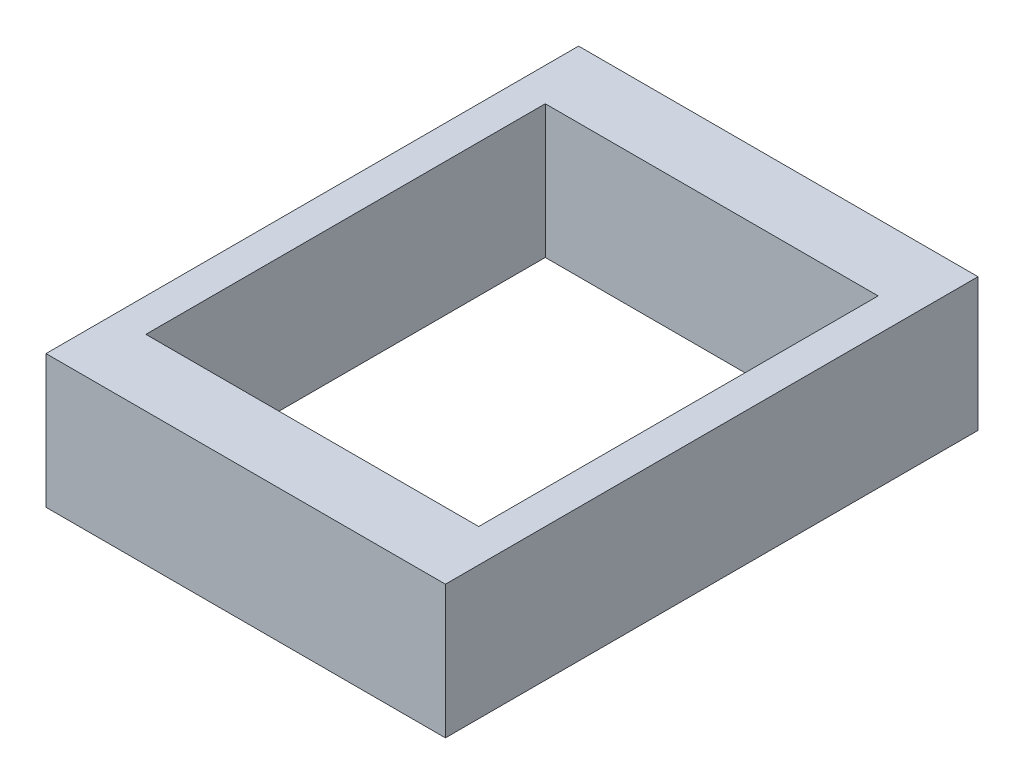
ISO-10303-21;
HEADER;
FILE_DESCRIPTION(('STEP AP214'),'2;1');
FILE_NAME('part.step','',(''),(''),'','','');
FILE_SCHEMA(('AUTOMOTIVE_DESIGN { 1 0 10303 214 1 1 1 1 }'));
ENDSEC;
DATA;
#1=APPLICATION_CONTEXT('core data for automotive mechanical design processes');
#2=APPLICATION_PROTOCOL_DEFINITION('international standard','automotive_design',2000,#1);
#3=PRODUCT_CONTEXT('',#1,'mechanical');
#4=PRODUCT('Part','Part','',(#3));
#5=PRODUCT_RELATED_PRODUCT_CATEGORY('part','',(#4));
#6=PRODUCT_DEFINITION_FORMATION('','',#4);
#7=PRODUCT_DEFINITION_CONTEXT('part definition',#1,'design');
#8=PRODUCT_DEFINITION('design','',#6,#7);
#9=PRODUCT_DEFINITION_SHAPE('','',#8);
#10=(LENGTH_UNIT() NAMED_UNIT(*) SI_UNIT(.MILLI.,.METRE.));
#11=(NAMED_UNIT(*) PLANE_ANGLE_UNIT() SI_UNIT($,.RADIAN.));
#12=(NAMED_UNIT(*) SI_UNIT($,.STERADIAN.) SOLID_ANGLE_UNIT());
#13=UNCERTAINTY_MEASURE_WITH_UNIT(LENGTH_MEASURE(1.E-05),#10,'distance_accuracy_value','');
#14=(GEOMETRIC_REPRESENTATION_CONTEXT(3) GLOBAL_UNCERTAINTY_ASSIGNED_CONTEXT((#13)) GLOBAL_UNIT_ASSIGNED_CONTEXT((#10,
#11,#12)) REPRESENTATION_CONTEXT('',''));
#15=CARTESIAN_POINT('',(0.,0.,0.));
#16=DIRECTION('',(0.,0.,1.));
#17=DIRECTION('',(1.,0.,0.));
#18=AXIS2_PLACEMENT_3D('',#15,#16,#17);
#19=CARTESIAN_POINT('',(38.1,25.4,50.8));
#20=DIRECTION('',(-1.,0.,0.));
#21=DIRECTION('',(0.,0.,1.));
#22=AXIS2_PLACEMENT_3D('',#19,#20,#21);
#23=PLANE('',#22);
#24=DIRECTION('',(0.,0.,-1.));
#25=VECTOR('',#24,1.);
#26=CARTESIAN_POINT('',(38.1,0.,50.8));
#27=LINE('',#26,#25);
#28=CARTESIAN_POINT('',(38.1,0.,50.8));
#29=VERTEX_POINT('',#28);
#30=CARTESIAN_POINT('',(38.1,0.,-50.8));
#31=VERTEX_POINT('',#30);
#32=EDGE_CURVE('E147',#29,#31,#27,.T.);
#33=ORIENTED_EDGE('',*,*,#32,.T.);
#34=DIRECTION('',(0.,-1.,0.));
#35=VECTOR('',#34,1.);
#36=CARTESIAN_POINT('',(38.1,25.4,-50.8));
#37=LINE('',#36,#35);
#38=CARTESIAN_POINT('',(38.1,25.4,-50.8));
#39=VERTEX_POINT('',#38);
#40=EDGE_CURVE('E11',#39,#31,#37,.T.);
#41=ORIENTED_EDGE('',*,*,#40,.F.);
#42=DIRECTION('',(0.,0.,-1.));
#43=VECTOR('',#42,1.);
#44=CARTESIAN_POINT('',(38.1,25.4,50.8));
#45=LINE('',#44,#43);
#46=CARTESIAN_POINT('',(38.1,25.4,50.8));
#47=VERTEX_POINT('',#46);
#48=EDGE_CURVE('E153',#47,#39,#45,.T.);
#49=ORIENTED_EDGE('',*,*,#48,.F.);
#50=DIRECTION('',(0.,-1.,0.));
#51=VECTOR('',#50,1.);
#52=CARTESIAN_POINT('',(38.1,25.4,50.8));
#53=LINE('',#52,#51);
#54=EDGE_CURVE('E167',#47,#29,#53,.T.);
#55=ORIENTED_EDGE('',*,*,#54,.T.);
#56=EDGE_LOOP('',(#33,#41,#49,#55));
#57=FACE_BOUND('',#56,.T.);
#58=ADVANCED_FACE('F39',(#57),#23,.F.);
#59=CARTESIAN_POINT('',(-38.1,25.4,-50.8));
#60=DIRECTION('',(0.,0.,1.));
#61=DIRECTION('',(1.,0.,0.));
#62=AXIS2_PLACEMENT_3D('',#59,#60,#61);
#63=PLANE('',#62);
#64=DIRECTION('',(-1.,0.,0.));
#65=VECTOR('',#64,1.);
#66=CARTESIAN_POINT('',(-38.1,0.,-50.8));
#67=LINE('',#66,#65);
#68=CARTESIAN_POINT('',(-38.1,0.,-50.8));
#69=VERTEX_POINT('',#68);
#70=EDGE_CURVE('E171',#31,#69,#67,.T.);
#71=ORIENTED_EDGE('',*,*,#70,.T.);
#72=DIRECTION('',(0.,-1.,0.));
#73=VECTOR('',#72,1.);
#74=CARTESIAN_POINT('',(-38.1,25.4,-50.8));
#75=LINE('',#74,#73);
#76=CARTESIAN_POINT('',(-38.1,25.4,-50.8));
#77=VERTEX_POINT('',#76);
#78=EDGE_CURVE('E47',#77,#69,#75,.T.);
#79=ORIENTED_EDGE('',*,*,#78,.F.);
#80=DIRECTION('',(-1.,0.,0.));
#81=VECTOR('',#80,1.);
#82=CARTESIAN_POINT('',(-38.1,25.4,-50.8));
#83=LINE('',#82,#81);
#84=EDGE_CURVE('E157',#39,#77,#83,.T.);
#85=ORIENTED_EDGE('',*,*,#84,.F.);
#86=ORIENTED_EDGE('',*,*,#40,.T.);
#87=EDGE_LOOP('',(#71,#79,#85,#86));
#88=FACE_BOUND('',#87,.T.);
#89=ADVANCED_FACE('F205',(#88),#63,.F.);
#90=CARTESIAN_POINT('',(-38.1,25.4,50.8));
#91=DIRECTION('',(1.,0.,0.));
#92=DIRECTION('',(0.,0.,-1.));
#93=AXIS2_PLACEMENT_3D('',#90,#91,#92);
#94=PLANE('',#93);
#95=DIRECTION('',(0.,0.,1.));
#96=VECTOR('',#95,1.);
#97=CARTESIAN_POINT('',(-38.1,0.,50.8));
#98=LINE('',#97,#96);
#99=CARTESIAN_POINT('',(-38.1,0.,50.8));
#100=VERTEX_POINT('',#99);
#101=EDGE_CURVE('E174',#69,#100,#98,.T.);
#102=ORIENTED_EDGE('',*,*,#101,.T.);
#103=DIRECTION('',(0.,-1.,0.));
#104=VECTOR('',#103,1.);
#105=CARTESIAN_POINT('',(-38.1,25.4,50.8));
#106=LINE('',#105,#104);
#107=CARTESIAN_POINT('',(-38.1,25.4,50.8));
#108=VERTEX_POINT('',#107);
#109=EDGE_CURVE('E182',#108,#100,#106,.T.);
#110=ORIENTED_EDGE('',*,*,#109,.F.);
#111=DIRECTION('',(0.,0.,1.));
#112=VECTOR('',#111,1.);
#113=CARTESIAN_POINT('',(-38.1,25.4,50.8));
#114=LINE('',#113,#112);
#115=EDGE_CURVE('E161',#77,#108,#114,.T.);
#116=ORIENTED_EDGE('',*,*,#115,.F.);
#117=ORIENTED_EDGE('',*,*,#78,.T.);
#118=EDGE_LOOP('',(#102,#110,#116,#117));
#119=FACE_BOUND('',#118,.T.);
#120=ADVANCED_FACE('F191',(#119),#94,.F.);
#121=CARTESIAN_POINT('',(-38.1,25.4,50.8));
#122=DIRECTION('',(0.,0.,-1.));
#123=DIRECTION('',(-1.,0.,0.));
#124=AXIS2_PLACEMENT_3D('',#121,#122,#123);
#125=PLANE('',#124);
#126=DIRECTION('',(1.,0.,0.));
#127=VECTOR('',#126,1.);
#128=CARTESIAN_POINT('',(-38.1,0.,50.8));
#129=LINE('',#128,#127);
#130=EDGE_CURVE('E158',#100,#29,#129,.T.);
#131=ORIENTED_EDGE('',*,*,#130,.T.);
#132=ORIENTED_EDGE('',*,*,#54,.F.);
#133=DIRECTION('',(1.,0.,0.));
#134=VECTOR('',#133,1.);
#135=CARTESIAN_POINT('',(-38.1,25.4,50.8));
#136=LINE('',#135,#134);
#137=EDGE_CURVE('E164',#108,#47,#136,.T.);
#138=ORIENTED_EDGE('',*,*,#137,.F.);
#139=ORIENTED_EDGE('',*,*,#109,.T.);
#140=EDGE_LOOP('',(#131,#132,#138,#139));
#141=FACE_BOUND('',#140,.T.);
#142=ADVANCED_FACE('F198',(#141),#125,.F.);
#143=CARTESIAN_POINT('',(0.,25.4,0.));
#144=DIRECTION('',(0.,-1.,0.));
#145=DIRECTION('',(0.,0.,-1.));
#146=AXIS2_PLACEMENT_3D('',#143,#144,#145);
#147=PLANE('',#146);
#148=DIRECTION('',(-1.,0.,0.));
#149=VECTOR('',#148,1.);
#150=CARTESIAN_POINT('',(-31.75,25.4,-38.1));
#151=LINE('',#150,#149);
#152=CARTESIAN_POINT('',(31.75,25.4,-38.1));
#153=VERTEX_POINT('',#152);
#154=CARTESIAN_POINT('',(-31.75,25.4,-38.1));
#155=VERTEX_POINT('',#154);
#156=EDGE_CURVE('E138',#153,#155,#151,.T.);
#157=ORIENTED_EDGE('',*,*,#156,.F.);
#158=DIRECTION('',(0.,0.,-1.));
#159=VECTOR('',#158,1.);
#160=CARTESIAN_POINT('',(31.75,25.4,38.1));
#161=LINE('',#160,#159);
#162=CARTESIAN_POINT('',(31.75,25.4,38.1));
#163=VERTEX_POINT('',#162);
#164=EDGE_CURVE('E54',#163,#153,#161,.T.);
#165=ORIENTED_EDGE('',*,*,#164,.F.);
#166=DIRECTION('',(1.,0.,0.));
#167=VECTOR('',#166,1.);
#168=CARTESIAN_POINT('',(-31.75,25.4,38.1));
#169=LINE('',#168,#167);
#170=CARTESIAN_POINT('',(-31.75,25.4,38.1));
#171=VERTEX_POINT('',#170);
#172=EDGE_CURVE('E125',#171,#163,#169,.T.);
#173=ORIENTED_EDGE('',*,*,#172,.F.);
#174=DIRECTION('',(0.,0.,1.));
#175=VECTOR('',#174,1.);
#176=CARTESIAN_POINT('',(-31.75,25.4,38.1));
#177=LINE('',#176,#175);
#178=EDGE_CURVE('E129',#155,#171,#177,.T.);
#179=ORIENTED_EDGE('',*,*,#178,.F.);
#180=EDGE_LOOP('',(#157,#165,#173,#179));
#181=FACE_BOUND('',#180,.T.);
#182=ORIENTED_EDGE('',*,*,#48,.T.);
#183=ORIENTED_EDGE('',*,*,#84,.T.);
#184=ORIENTED_EDGE('',*,*,#115,.T.);
#185=ORIENTED_EDGE('',*,*,#137,.T.);
#186=EDGE_LOOP('',(#182,#183,#184,#185));
#187=FACE_BOUND('',#186,.T.);
#188=ADVANCED_FACE('F204',(#181,#187),#147,.F.);
#189=CARTESIAN_POINT('',(0.,0.,0.));
#190=DIRECTION('',(0.,-1.,0.));
#191=DIRECTION('',(0.,0.,-1.));
#192=AXIS2_PLACEMENT_3D('',#189,#190,#191);
#193=PLANE('',#192);
#194=DIRECTION('',(0.,0.,-1.));
#195=VECTOR('',#194,1.);
#196=CARTESIAN_POINT('',(31.75,0.,38.1));
#197=LINE('',#196,#195);
#198=CARTESIAN_POINT('',(31.75,0.,38.1));
#199=VERTEX_POINT('',#198);
#200=CARTESIAN_POINT('',(31.75,0.,-38.1));
#201=VERTEX_POINT('',#200);
#202=EDGE_CURVE('E106',#199,#201,#197,.T.);
#203=ORIENTED_EDGE('',*,*,#202,.T.);
#204=DIRECTION('',(-1.,0.,0.));
#205=VECTOR('',#204,1.);
#206=CARTESIAN_POINT('',(-31.75,0.,-38.1));
#207=LINE('',#206,#205);
#208=CARTESIAN_POINT('',(-31.75,0.,-38.1));
#209=VERTEX_POINT('',#208);
#210=EDGE_CURVE('E116',#201,#209,#207,.T.);
#211=ORIENTED_EDGE('',*,*,#210,.T.);
#212=DIRECTION('',(0.,0.,1.));
#213=VECTOR('',#212,1.);
#214=CARTESIAN_POINT('',(-31.75,0.,38.1));
#215=LINE('',#214,#213);
#216=CARTESIAN_POINT('',(-31.75,0.,38.1));
#217=VERTEX_POINT('',#216);
#218=EDGE_CURVE('E62',#209,#217,#215,.T.);
#219=ORIENTED_EDGE('',*,*,#218,.T.);
#220=DIRECTION('',(1.,0.,0.));
#221=VECTOR('',#220,1.);
#222=CARTESIAN_POINT('',(-31.75,0.,38.1));
#223=LINE('',#222,#221);
#224=EDGE_CURVE('E113',#217,#199,#223,.T.);
#225=ORIENTED_EDGE('',*,*,#224,.T.);
#226=EDGE_LOOP('',(#203,#211,#219,#225));
#227=FACE_BOUND('',#226,.T.);
#228=ORIENTED_EDGE('',*,*,#32,.F.);
#229=ORIENTED_EDGE('',*,*,#130,.F.);
#230=ORIENTED_EDGE('',*,*,#101,.F.);
#231=ORIENTED_EDGE('',*,*,#70,.F.);
#232=EDGE_LOOP('',(#228,#229,#230,#231));
#233=FACE_BOUND('',#232,.T.);
#234=ADVANCED_FACE('F121',(#227,#233),#193,.T.);
#235=CARTESIAN_POINT('',(31.75,0.,38.1));
#236=DIRECTION('',(1.,0.,0.));
#237=DIRECTION('',(0.,0.,-1.));
#238=AXIS2_PLACEMENT_3D('',#235,#236,#237);
#239=PLANE('',#238);
#240=ORIENTED_EDGE('',*,*,#164,.T.);
#241=DIRECTION('',(0.,1.,0.));
#242=VECTOR('',#241,1.);
#243=CARTESIAN_POINT('',(31.75,0.,-38.1));
#244=LINE('',#243,#242);
#245=EDGE_CURVE('E102',#201,#153,#244,.T.);
#246=ORIENTED_EDGE('',*,*,#245,.F.);
#247=ORIENTED_EDGE('',*,*,#202,.F.);
#248=DIRECTION('',(0.,1.,0.));
#249=VECTOR('',#248,1.);
#250=CARTESIAN_POINT('',(31.75,0.,38.1));
#251=LINE('',#250,#249);
#252=EDGE_CURVE('E144',#199,#163,#251,.T.);
#253=ORIENTED_EDGE('',*,*,#252,.T.);
#254=EDGE_LOOP('',(#240,#246,#247,#253));
#255=FACE_BOUND('',#254,.T.);
#256=ADVANCED_FACE('F104',(#255),#239,.F.);
#257=CARTESIAN_POINT('',(-31.75,0.,38.1));
#258=DIRECTION('',(0.,0.,1.));
#259=DIRECTION('',(1.,0.,0.));
#260=AXIS2_PLACEMENT_3D('',#257,#258,#259);
#261=PLANE('',#260);
#262=ORIENTED_EDGE('',*,*,#172,.T.);
#263=ORIENTED_EDGE('',*,*,#252,.F.);
#264=ORIENTED_EDGE('',*,*,#224,.F.);
#265=DIRECTION('',(0.,1.,0.));
#266=VECTOR('',#265,1.);
#267=CARTESIAN_POINT('',(-31.75,0.,38.1));
#268=LINE('',#267,#266);
#269=EDGE_CURVE('E148',#217,#171,#268,.T.);
#270=ORIENTED_EDGE('',*,*,#269,.T.);
#271=EDGE_LOOP('',(#262,#263,#264,#270));
#272=FACE_BOUND('',#271,.T.);
#273=ADVANCED_FACE('F222',(#272),#261,.F.);
#274=CARTESIAN_POINT('',(-31.75,0.,38.1));
#275=DIRECTION('',(-1.,0.,0.));
#276=DIRECTION('',(0.,0.,1.));
#277=AXIS2_PLACEMENT_3D('',#274,#275,#276);
#278=PLANE('',#277);
#279=ORIENTED_EDGE('',*,*,#178,.T.);
#280=ORIENTED_EDGE('',*,*,#269,.F.);
#281=ORIENTED_EDGE('',*,*,#218,.F.);
#282=DIRECTION('',(0.,1.,0.));
#283=VECTOR('',#282,1.);
#284=CARTESIAN_POINT('',(-31.75,0.,-38.1));
#285=LINE('',#284,#283);
#286=EDGE_CURVE('E112',#209,#155,#285,.T.);
#287=ORIENTED_EDGE('',*,*,#286,.T.);
#288=EDGE_LOOP('',(#279,#280,#281,#287));
#289=FACE_BOUND('',#288,.T.);
#290=ADVANCED_FACE('F225',(#289),#278,.F.);
#291=CARTESIAN_POINT('',(-31.75,0.,-38.1));
#292=DIRECTION('',(0.,0.,-1.));
#293=DIRECTION('',(-1.,0.,0.));
#294=AXIS2_PLACEMENT_3D('',#291,#292,#293);
#295=PLANE('',#294);
#296=ORIENTED_EDGE('',*,*,#156,.T.);
#297=ORIENTED_EDGE('',*,*,#286,.F.);
#298=ORIENTED_EDGE('',*,*,#210,.F.);
#299=ORIENTED_EDGE('',*,*,#245,.T.);
#300=EDGE_LOOP('',(#296,#297,#298,#299));
#301=FACE_BOUND('',#300,.T.);
#302=ADVANCED_FACE('F117',(#301),#295,.F.);
#303=CLOSED_SHELL('',(#58,#89,#120,#142,#188,#234,#256,#273,#290,#302));
#304=MANIFOLD_SOLID_BREP('B2',#303);
#305=ADVANCED_BREP_SHAPE_REPRESENTATION('',(#18,#304),#14);
#306=SHAPE_DEFINITION_REPRESENTATION(#9,#305);
ENDSEC;
END-ISO-10303-21;
